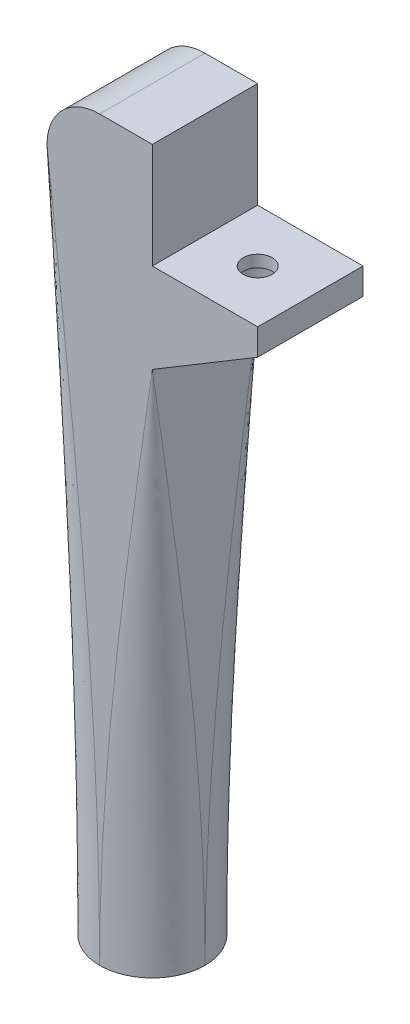
ISO-10303-21;
HEADER;
FILE_DESCRIPTION(('STEP AP214'),'2;1');
FILE_NAME('part.step','',(''),(''),'','','');
FILE_SCHEMA(('AUTOMOTIVE_DESIGN { 1 0 10303 214 1 1 1 1 }'));
ENDSEC;
DATA;
#1=APPLICATION_CONTEXT('core data for automotive mechanical design processes');
#2=APPLICATION_PROTOCOL_DEFINITION('international standard','automotive_design',2000,#1);
#3=PRODUCT_CONTEXT('',#1,'mechanical');
#4=PRODUCT('Part','Part','',(#3));
#5=PRODUCT_RELATED_PRODUCT_CATEGORY('part','',(#4));
#6=PRODUCT_DEFINITION_FORMATION('','',#4);
#7=PRODUCT_DEFINITION_CONTEXT('part definition',#1,'design');
#8=PRODUCT_DEFINITION('design','',#6,#7);
#9=PRODUCT_DEFINITION_SHAPE('','',#8);
#10=(LENGTH_UNIT() NAMED_UNIT(*) SI_UNIT(.MILLI.,.METRE.));
#11=(NAMED_UNIT(*) PLANE_ANGLE_UNIT() SI_UNIT($,.RADIAN.));
#12=(NAMED_UNIT(*) SI_UNIT($,.STERADIAN.) SOLID_ANGLE_UNIT());
#13=UNCERTAINTY_MEASURE_WITH_UNIT(LENGTH_MEASURE(1.E-05),#10,'distance_accuracy_value','');
#14=(GEOMETRIC_REPRESENTATION_CONTEXT(3) GLOBAL_UNCERTAINTY_ASSIGNED_CONTEXT((#13)) GLOBAL_UNIT_ASSIGNED_CONTEXT((#10,
#11,#12)) REPRESENTATION_CONTEXT('',''));
#15=CARTESIAN_POINT('',(0.,0.,0.));
#16=DIRECTION('',(0.,0.,1.));
#17=DIRECTION('',(1.,0.,0.));
#18=AXIS2_PLACEMENT_3D('',#15,#16,#17);
#19=CARTESIAN_POINT('',(0.,0.,20.));
#20=DIRECTION('',(0.,1.,0.));
#21=DIRECTION('',(0.,0.,1.));
#22=AXIS2_PLACEMENT_3D('',#19,#20,#21);
#23=PLANE('',#22);
#24=CARTESIAN_POINT('',(10.,0.,10.));
#25=DIRECTION('',(0.,1.,0.));
#26=DIRECTION('',(0.,0.,1.));
#27=AXIS2_PLACEMENT_3D('',#24,#25,#26);
#28=CIRCLE('',#27,2.75);
#29=CARTESIAN_POINT('',(10.,0.,12.75));
#30=VERTEX_POINT('',#29);
#31=EDGE_CURVE('E11',#30,#30,#28,.T.);
#32=ORIENTED_EDGE('',*,*,#31,.T.);
#33=EDGE_LOOP('',(#32));
#34=FACE_BOUND('',#33,.T.);
#35=CARTESIAN_POINT('',(10.,0.,20.));
#36=CARTESIAN_POINT('',(9.75271987841277,0.,20.000017841492));
#37=CARTESIAN_POINT('',(9.50544294645493,0.,19.9908285391097));
#38=CARTESIAN_POINT('',(9.01227790934417,0.,19.954167037792));
#39=CARTESIAN_POINT('',(8.76638963961477,0.,19.9266970532694));
#40=CARTESIAN_POINT('',(8.27726687450478,0.,19.853597009447));
#41=CARTESIAN_POINT('',(8.03403301047984,0.,19.8079627224572));
#42=CARTESIAN_POINT('',(7.5516013686121,0.,19.698789343571));
#43=CARTESIAN_POINT('',(7.31240396160714,0.,19.6352486159618));
#44=CARTESIAN_POINT('',(6.80705088746999,0.,19.4807218306052));
#45=CARTESIAN_POINT('',(6.54167485102888,0.,19.3871726953676));
#46=CARTESIAN_POINT('',(6.01974303253944,0.,19.1780500638151));
#47=CARTESIAN_POINT('',(5.76318766478499,0.,19.0624755346632));
#48=CARTESIAN_POINT('',(5.26070847028161,0.,18.8101168739883));
#49=CARTESIAN_POINT('',(5.01478524418366,0.,18.6733315461819));
#50=CARTESIAN_POINT('',(4.53534312897896,0.,18.3795328168102));
#51=CARTESIAN_POINT('',(4.3018239405806,0.,18.222519903621));
#52=CARTESIAN_POINT('',(3.84885547144545,0.,17.889388785411));
#53=CARTESIAN_POINT('',(3.62940541326505,0.,17.7132716375181));
#54=CARTESIAN_POINT('',(3.20611958473941,0.,17.3431754175425));
#55=CARTESIAN_POINT('',(3.00228394724205,0.,17.1491961935197));
#56=CARTESIAN_POINT('',(2.61166633010787,0.,16.7447439739679));
#57=CARTESIAN_POINT('',(2.42488537371347,0.,16.5342699901964));
#58=CARTESIAN_POINT('',(2.06972093199635,0.,16.0983372777068));
#59=CARTESIAN_POINT('',(1.90133723472248,0.,15.8728787216711));
#60=CARTESIAN_POINT('',(1.58414331189207,0.,15.4085505860467));
#61=CARTESIAN_POINT('',(1.43533540195067,0.,15.1696794246442));
#62=CARTESIAN_POINT('',(1.15837265860147,0.,14.6802444795628));
#63=CARTESIAN_POINT('',(1.03021808306839,0.,14.4296805499399));
#64=CARTESIAN_POINT('',(0.795502949164731,0.,13.9187075581249));
#65=CARTESIAN_POINT('',(0.688937579654796,0.,13.6583007048037));
#66=CARTESIAN_POINT('',(0.498133449714636,0.,13.1294606016106));
#67=CARTESIAN_POINT('',(0.413891168555817,0.,12.8610286248769));
#68=CARTESIAN_POINT('',(0.284551415680254,0.,12.3786083529401));
#69=CARTESIAN_POINT('',(0.234914031101588,0.,12.1658240311521));
#70=CARTESIAN_POINT('',(0.149675911134503,0.,11.7374679470184));
#71=CARTESIAN_POINT('',(0.114074149273069,0.,11.5218963897041));
#72=CARTESIAN_POINT('',(0.0570893449069655,0.,11.0890886521056));
#73=CARTESIAN_POINT('',(0.0356931222786334,0.,10.8718542045453));
#74=CARTESIAN_POINT('',(0.00714189852537917,0.,10.4364141218775));
#75=CARTESIAN_POINT('',(-1.06540741449135E-05,0.,10.2182083262528));
#76=CARTESIAN_POINT('',(0.,0.,10.));
#77=B_SPLINE_CURVE_WITH_KNOTS('',3,(#35,#36,#37,#38,#39,#40,#41,#42,#43,#44,#45,#46,#47,#48,#49,
#50,#51,#52,#53,#54,#55,#56,#57,#58,#59,#60,#61,#62,#63,#64,#65,#66,#67,#68,#69,#70,#71,#72,#73,
#74,#75,#76),.UNSPECIFIED.,.F.,.F.,(4,2,2,2,2,2,2,2,2,2,2,2,2,2,2,2,2,2,2,2,4),(0.,
0.741664636519439,1.48323944856296,2.22498696106609,2.96680225249434,3.80992652672874,
4.65309034732577,5.49630173944328,6.3394927768311,7.18263718024128,8.02578875634769,
8.86899088645285,9.71218330116971,10.5554753673976,11.3987779620392,12.2418924200681,
13.0848738254359,13.7399212627882,14.3949207853939,15.0493117366551,15.7038151697833),.UNSPECIFIED.);
#78=CARTESIAN_POINT('',(10.,0.,20.));
#79=VERTEX_POINT('',#78);
#80=CARTESIAN_POINT('',(0.,0.,10.));
#81=VERTEX_POINT('',#80);
#82=EDGE_CURVE('E216',#79,#81,#77,.T.);
#83=ORIENTED_EDGE('',*,*,#82,.T.);
#84=CARTESIAN_POINT('',(0.,0.,10.));
#85=CARTESIAN_POINT('',(-1.78414919729804E-05,0.,9.75271987841277));
#86=CARTESIAN_POINT('',(0.00917146089034212,0.,9.50544294645493));
#87=CARTESIAN_POINT('',(0.0458329622079737,0.,9.01227790934417));
#88=CARTESIAN_POINT('',(0.0733029467306176,0.,8.76638963961477));
#89=CARTESIAN_POINT('',(0.146402990552991,0.,8.27726687450478));
#90=CARTESIAN_POINT('',(0.192037277542756,0.,8.03403301047983));
#91=CARTESIAN_POINT('',(0.301210656429029,0.,7.55160136861209));
#92=CARTESIAN_POINT('',(0.364751384038197,0.,7.31240396160713));
#93=CARTESIAN_POINT('',(0.519278169394786,0.,6.80705088746999));
#94=CARTESIAN_POINT('',(0.612827304632361,0.,6.54167485102888));
#95=CARTESIAN_POINT('',(0.821949936184924,0.,6.01974303253944));
#96=CARTESIAN_POINT('',(0.937524465336791,0.,5.76318766478498));
#97=CARTESIAN_POINT('',(1.18988312601173,0.,5.26070847028161));
#98=CARTESIAN_POINT('',(1.32666845381815,0.,5.01478524418366));
#99=CARTESIAN_POINT('',(1.62046718318978,0.,4.53534312897896));
#100=CARTESIAN_POINT('',(1.77748009637903,0.,4.3018239405806));
#101=CARTESIAN_POINT('',(2.11061121458902,0.,3.84885547144545));
#102=CARTESIAN_POINT('',(2.28672836248191,0.,3.62940541326505));
#103=CARTESIAN_POINT('',(2.65682458245751,0.,3.20611958473942));
#104=CARTESIAN_POINT('',(2.85080380648027,0.,3.00228394724205));
#105=CARTESIAN_POINT('',(3.2552560260321,0.,2.61166633010787));
#106=CARTESIAN_POINT('',(3.46573000980356,0.,2.42488537371347));
#107=CARTESIAN_POINT('',(3.90166272229319,0.,2.06972093199636));
#108=CARTESIAN_POINT('',(4.12712127832894,0.,1.90133723472248));
#109=CARTESIAN_POINT('',(4.59144941395329,0.,1.58414331189207));
#110=CARTESIAN_POINT('',(4.8303205753558,0.,1.43533540195067));
#111=CARTESIAN_POINT('',(5.31975552043722,0.,1.15837265860148));
#112=CARTESIAN_POINT('',(5.57031945006007,0.,1.0302180830684));
#113=CARTESIAN_POINT('',(6.08129244187512,0.,0.795502949164733));
#114=CARTESIAN_POINT('',(6.34169929519632,0.,0.688937579654798));
#115=CARTESIAN_POINT('',(6.87053939838941,0.,0.498133449714637));
#116=CARTESIAN_POINT('',(7.13897137512309,0.,0.413891168555818));
#117=CARTESIAN_POINT('',(7.62139164705989,0.,0.284551415680255));
#118=CARTESIAN_POINT('',(7.8341759688479,0.,0.234914031101589));
#119=CARTESIAN_POINT('',(8.26253205298162,0.,0.149675911134504));
#120=CARTESIAN_POINT('',(8.47810361029594,0.,0.11407414927307));
#121=CARTESIAN_POINT('',(8.91091134789444,0.,0.0570893449069657));
#122=CARTESIAN_POINT('',(9.12814579545467,0.,0.0356931222786335));
#123=CARTESIAN_POINT('',(9.56358587812255,0.,0.00714189852537915));
#124=CARTESIAN_POINT('',(9.78179167374726,0.,-1.06540741449037E-05));
#125=CARTESIAN_POINT('',(10.,0.,0.));
#126=B_SPLINE_CURVE_WITH_KNOTS('',3,(#84,#85,#86,#87,#88,#89,#90,#91,#92,#93,#94,#95,#96,#97,
#98,#99,#100,#101,#102,#103,#104,#105,#106,#107,#108,#109,#110,#111,#112,#113,#114,#115,#116,
#117,#118,#119,#120,#121,#122,#123,#124,#125),.UNSPECIFIED.,.F.,.F.,(4,2,2,2,2,2,2,2,2,2,2,2,2,
2,2,2,2,2,2,2,4),(0.,0.741664636519441,1.48323944856296,2.2249869610661,2.96680225249435,
3.80992652672875,4.65309034732578,5.49630173944328,6.33949277683111,7.18263718024129,
8.02578875634768,8.86899088645285,9.71218330116971,10.5554753673976,11.3987779620392,
12.2418924200681,13.0848738254359,13.7399212627882,14.3949207853939,15.0493117366551,
15.7038151697833),.UNSPECIFIED.);
#127=CARTESIAN_POINT('',(9.99999999999999,0.,0.));
#128=VERTEX_POINT('',#127);
#129=EDGE_CURVE('E258',#81,#128,#126,.T.);
#130=ORIENTED_EDGE('',*,*,#129,.T.);
#131=CARTESIAN_POINT('',(9.99999999999999,0.,0.));
#132=CARTESIAN_POINT('',(10.2454570248079,0.,-1.73070754024521E-05));
#133=CARTESIAN_POINT('',(10.4909109087458,0.,0.0090367398370779));
#134=CARTESIAN_POINT('',(10.9804590130464,0.,0.045159927702347));
#135=CARTESIAN_POINT('',(11.2245533990691,0.,0.0722268230478383));
#136=CARTESIAN_POINT('',(11.7101587364008,0.,0.144258203646837));
#137=CARTESIAN_POINT('',(11.9516689476012,0.,0.189227682388885));
#138=CARTESIAN_POINT('',(12.4307421259728,0.,0.296816460765953));
#139=CARTESIAN_POINT('',(12.6683047112686,0.,0.359437457524258));
#140=CARTESIAN_POINT('',(13.1722516230165,0.,0.512333044816977));
#141=CARTESIAN_POINT('',(13.4378236260894,0.,0.605300022705861));
#142=CARTESIAN_POINT('',(13.9602075972998,0.,0.81328092437707));
#143=CARTESIAN_POINT('',(14.2170187483315,0.,0.928296898035205));
#144=CARTESIAN_POINT('',(14.7200497958023,0.,1.17955941158218));
#145=CARTESIAN_POINT('',(14.9662693388811,0.,1.31580665909479));
#146=CARTESIAN_POINT('',(15.4463550388694,0.,1.60856001244902));
#147=CARTESIAN_POINT('',(15.6802211535875,0.,1.76506618747571));
#148=CARTESIAN_POINT('',(16.1339207350364,0.,2.09721242950568));
#149=CARTESIAN_POINT('',(16.3537552162283,0.,2.2728511107735));
#150=CARTESIAN_POINT('',(16.7778488131828,0.,2.64202457370424));
#151=CARTESIAN_POINT('',(16.9821077936115,0.,2.83555951083355));
#152=CARTESIAN_POINT('',(17.3736065050345,0.,3.2391589129875));
#153=CARTESIAN_POINT('',(17.5608453430407,0.,3.44922424422742));
#154=CARTESIAN_POINT('',(17.9169584485869,0.,3.88437967054396));
#155=CARTESIAN_POINT('',(18.0858329240806,0.,4.10946959543909));
#156=CARTESIAN_POINT('',(18.4040373129911,0.,4.5731022706718));
#157=CARTESIAN_POINT('',(18.5533649798149,0.,4.81164656287323));
#158=CARTESIAN_POINT('',(18.831392936054,0.,5.30047235943414));
#159=CARTESIAN_POINT('',(18.9600929889025,0.,5.55075399836023));
#160=CARTESIAN_POINT('',(19.1959225416279,0.,6.06121285578132));
#161=CARTESIAN_POINT('',(19.3030565640279,0.,6.32138798591885));
#162=CARTESIAN_POINT('',(19.4950156525827,0.,6.84981410042397));
#163=CARTESIAN_POINT('',(19.5798441390948,0.,7.11806383958262));
#164=CARTESIAN_POINT('',(19.7107104149243,0.,7.60195545500086));
#165=CARTESIAN_POINT('',(19.761170273782,0.,7.81641390804639));
#166=CARTESIAN_POINT('',(19.847823692893,0.,8.24818832096255));
#167=CARTESIAN_POINT('',(19.8840182742843,0.,8.46550407515049));
#168=CARTESIAN_POINT('',(19.9419544466413,0.,8.90185357736196));
#169=CARTESIAN_POINT('',(19.9637089062576,0.,9.12088561923699));
#170=CARTESIAN_POINT('',(19.9927384205511,0.,9.55994414405435));
#171=CARTESIAN_POINT('',(20.0000110264744,0.,9.77997078887215));
#172=CARTESIAN_POINT('',(20.,0.,10.));
#173=B_SPLINE_CURVE_WITH_KNOTS('',3,(#131,#132,#133,#134,#135,#136,#137,#138,#139,#140,#141,
#142,#143,#144,#145,#146,#147,#148,#149,#150,#151,#152,#153,#154,#155,#156,#157,#158,#159,#160,
#161,#162,#163,#164,#165,#166,#167,#168,#169,#170,#171,#172),.UNSPECIFIED.,.F.,.F.,(4,2,2,2,2,2,
2,2,2,2,2,2,2,2,2,2,2,2,2,2,4),(0.,0.736199150653442,1.47230653877572,2.20861939009667,
2.94500305913229,3.78810210086328,4.63127956281891,5.47448513331312,6.3176935834653,
7.16084100199459,8.00399574570977,8.84719470134638,9.69038410780451,10.5336703404658,
11.3769662436206,12.2200851180189,13.0630746320776,13.7235627974722,14.3840036751724,
15.0438551925732,15.7038182755789),.UNSPECIFIED.);
#174=CARTESIAN_POINT('',(20.,0.,9.99999999999999));
#175=VERTEX_POINT('',#174);
#176=EDGE_CURVE('E252',#128,#175,#173,.T.);
#177=ORIENTED_EDGE('',*,*,#176,.T.);
#178=CARTESIAN_POINT('',(20.,0.,9.99999999999999));
#179=CARTESIAN_POINT('',(20.0000173070754,0.,10.2454570248079));
#180=CARTESIAN_POINT('',(19.9909632601629,0.,10.4909109087458));
#181=CARTESIAN_POINT('',(19.9548400722976,0.,10.9804590130464));
#182=CARTESIAN_POINT('',(19.9277731769522,0.,11.2245533990691));
#183=CARTESIAN_POINT('',(19.8557417963532,0.,11.7101587364008));
#184=CARTESIAN_POINT('',(19.8107723176111,0.,11.9516689476012));
#185=CARTESIAN_POINT('',(19.703183539234,0.,12.4307421259728));
#186=CARTESIAN_POINT('',(19.6405625424757,0.,12.6683047112686));
#187=CARTESIAN_POINT('',(19.487666955183,0.,13.1722516230165));
#188=CARTESIAN_POINT('',(19.3946999772941,0.,13.4378236260894));
#189=CARTESIAN_POINT('',(19.1867190756229,0.,13.9602075972998));
#190=CARTESIAN_POINT('',(19.0717031019648,0.,14.2170187483315));
#191=CARTESIAN_POINT('',(18.8204405884178,0.,14.7200497958023));
#192=CARTESIAN_POINT('',(18.6841933409052,0.,14.9662693388812));
#193=CARTESIAN_POINT('',(18.391439987551,0.,15.4463550388694));
#194=CARTESIAN_POINT('',(18.2349338125243,0.,15.6802211535875));
#195=CARTESIAN_POINT('',(17.9027875704943,0.,16.1339207350364));
#196=CARTESIAN_POINT('',(17.7271488892265,0.,16.3537552162283));
#197=CARTESIAN_POINT('',(17.3579754262957,0.,16.7778488131828));
#198=CARTESIAN_POINT('',(17.1644404891664,0.,16.9821077936115));
#199=CARTESIAN_POINT('',(16.7608410870125,0.,17.3736065050345));
#200=CARTESIAN_POINT('',(16.5507757557726,0.,17.5608453430407));
#201=CARTESIAN_POINT('',(16.115620329456,0.,17.9169584485869));
#202=CARTESIAN_POINT('',(15.8905304045609,0.,18.0858329240806));
#203=CARTESIAN_POINT('',(15.4268977293282,0.,18.4040373129911));
#204=CARTESIAN_POINT('',(15.1883534371268,0.,18.5533649798149));
#205=CARTESIAN_POINT('',(14.6995276405659,0.,18.831392936054));
#206=CARTESIAN_POINT('',(14.4492460016398,0.,18.9600929889025));
#207=CARTESIAN_POINT('',(13.9387871442187,0.,19.1959225416279));
#208=CARTESIAN_POINT('',(13.6786120140811,0.,19.3030565640279));
#209=CARTESIAN_POINT('',(13.150185899576,0.,19.4950156525827));
#210=CARTESIAN_POINT('',(12.8819361604174,0.,19.5798441390948));
#211=CARTESIAN_POINT('',(12.3980445449991,0.,19.7107104149243));
#212=CARTESIAN_POINT('',(12.1835860919536,0.,19.761170273782));
#213=CARTESIAN_POINT('',(11.7518116790374,0.,19.847823692893));
#214=CARTESIAN_POINT('',(11.5344959248495,0.,19.8840182742843));
#215=CARTESIAN_POINT('',(11.098146422638,0.,19.9419544466413));
#216=CARTESIAN_POINT('',(10.879114380763,0.,19.9637089062576));
#217=CARTESIAN_POINT('',(10.4400558559456,0.,19.9927384205511));
#218=CARTESIAN_POINT('',(10.2200292111278,0.,20.0000110264743));
#219=CARTESIAN_POINT('',(9.99999999999999,0.,20.));
#220=B_SPLINE_CURVE_WITH_KNOTS('',3,(#178,#179,#180,#181,#182,#183,#184,#185,#186,#187,#188,
#189,#190,#191,#192,#193,#194,#195,#196,#197,#198,#199,#200,#201,#202,#203,#204,#205,#206,#207,
#208,#209,#210,#211,#212,#213,#214,#215,#216,#217,#218,#219),.UNSPECIFIED.,.F.,.F.,(4,2,2,2,2,2,
2,2,2,2,2,2,2,2,2,2,2,2,2,2,4),(0.,0.736199150653441,1.47230653877572,2.20861939009667,
2.94500305913229,3.78810210086329,4.63127956281891,5.47448513331313,6.31769358346531,
7.1608410019946,8.00399574570978,8.84719470134639,9.69038410780452,10.5336703404659,
11.3769662436206,12.2200851180189,13.0630746320776,13.7235627974722,14.3840036751724,
15.0438551925732,15.7038182755789),.UNSPECIFIED.);
#221=EDGE_CURVE('E226',#175,#79,#220,.T.);
#222=ORIENTED_EDGE('',*,*,#221,.T.);
#223=EDGE_LOOP('',(#83,#130,#177,#222));
#224=FACE_BOUND('',#223,.T.);
#225=ADVANCED_FACE('F43',(#34,#224),#23,.F.);
#226=CARTESIAN_POINT('',(-40.1470588235294,66.9117647058824,20.));
#227=DIRECTION('',(0.514495755427526,-0.857492925712544,0.));
#228=DIRECTION('',(0.857492925712544,0.514495755427526,0.));
#229=AXIS2_PLACEMENT_3D('',#226,#227,#228);
#230=PLANE('',#229);
#231=CARTESIAN_POINT('',(30.,109.,10.));
#232=DIRECTION('',(0.514495755427526,-0.857492925712544,0.));
#233=DIRECTION('',(-0.857492925712544,-0.514495755427526,0.));
#234=AXIS2_PLACEMENT_3D('',#231,#232,#233);
#235=ELLIPSE('',#234,6.12249948958756,5.25);
#236=CARTESIAN_POINT('',(24.75,105.85,10.));
#237=VERTEX_POINT('',#236);
#238=EDGE_CURVE('E136',#237,#237,#235,.T.);
#239=ORIENTED_EDGE('',*,*,#238,.F.);
#240=EDGE_LOOP('',(#239));
#241=FACE_BOUND('',#240,.T.);
#242=DIRECTION('',(-0.857492925712544,-0.514495755427526,0.));
#243=VECTOR('',#242,1.);
#244=CARTESIAN_POINT('',(-40.1470588235294,66.9117647058824,0.));
#245=LINE('',#244,#243);
#246=CARTESIAN_POINT('',(40.,115.,0.));
#247=VERTEX_POINT('',#246);
#248=CARTESIAN_POINT('',(20.,103.,0.));
#249=VERTEX_POINT('',#248);
#250=EDGE_CURVE('E153',#247,#249,#245,.T.);
#251=ORIENTED_EDGE('',*,*,#250,.F.);
#252=DIRECTION('',(0.,0.,-1.));
#253=VECTOR('',#252,1.);
#254=CARTESIAN_POINT('',(40.,115.,20.));
#255=LINE('',#254,#253);
#256=CARTESIAN_POINT('',(40.,115.,20.));
#257=VERTEX_POINT('',#256);
#258=EDGE_CURVE('E176',#257,#247,#255,.T.);
#259=ORIENTED_EDGE('',*,*,#258,.F.);
#260=DIRECTION('',(-0.857492925712544,-0.514495755427526,0.));
#261=VECTOR('',#260,1.);
#262=CARTESIAN_POINT('',(-40.1470588235294,66.9117647058824,20.));
#263=LINE('',#262,#261);
#264=CARTESIAN_POINT('',(20.,103.,20.));
#265=VERTEX_POINT('',#264);
#266=EDGE_CURVE('E137',#257,#265,#263,.T.);
#267=ORIENTED_EDGE('',*,*,#266,.T.);
#268=DIRECTION('',(0.,0.,-1.));
#269=VECTOR('',#268,1.);
#270=CARTESIAN_POINT('',(20.,103.,20.));
#271=LINE('',#270,#269);
#272=EDGE_CURVE('E152',#265,#249,#271,.T.);
#273=ORIENTED_EDGE('',*,*,#272,.T.);
#274=EDGE_LOOP('',(#251,#259,#267,#273));
#275=FACE_BOUND('',#274,.T.);
#276=ADVANCED_FACE('F242',(#241,#275),#230,.T.);
#277=CARTESIAN_POINT('',(40.,0.,20.));
#278=DIRECTION('',(1.,0.,0.));
#279=DIRECTION('',(0.,0.,-1.));
#280=AXIS2_PLACEMENT_3D('',#277,#278,#279);
#281=PLANE('',#280);
#282=DIRECTION('',(0.,-1.,0.));
#283=VECTOR('',#282,1.);
#284=CARTESIAN_POINT('',(40.,0.,0.));
#285=LINE('',#284,#283);
#286=CARTESIAN_POINT('',(40.,120.,0.));
#287=VERTEX_POINT('',#286);
#288=EDGE_CURVE('E156',#287,#247,#285,.T.);
#289=ORIENTED_EDGE('',*,*,#288,.F.);
#290=DIRECTION('',(0.,0.,-1.));
#291=VECTOR('',#290,1.);
#292=CARTESIAN_POINT('',(40.,120.,20.));
#293=LINE('',#292,#291);
#294=CARTESIAN_POINT('',(40.,120.,20.));
#295=VERTEX_POINT('',#294);
#296=EDGE_CURVE('E174',#295,#287,#293,.T.);
#297=ORIENTED_EDGE('',*,*,#296,.F.);
#298=DIRECTION('',(0.,-1.,0.));
#299=VECTOR('',#298,1.);
#300=CARTESIAN_POINT('',(40.,0.,20.));
#301=LINE('',#300,#299);
#302=EDGE_CURVE('E140',#295,#257,#301,.T.);
#303=ORIENTED_EDGE('',*,*,#302,.T.);
#304=ORIENTED_EDGE('',*,*,#258,.T.);
#305=EDGE_LOOP('',(#289,#297,#303,#304));
#306=FACE_BOUND('',#305,.T.);
#307=ADVANCED_FACE('F396',(#306),#281,.T.);
#308=CARTESIAN_POINT('',(0.,120.,20.));
#309=DIRECTION('',(0.,1.,0.));
#310=DIRECTION('',(0.,0.,1.));
#311=AXIS2_PLACEMENT_3D('',#308,#309,#310);
#312=PLANE('',#311);
#313=CARTESIAN_POINT('',(30.,120.,10.));
#314=DIRECTION('',(0.,1.,0.));
#315=DIRECTION('',(0.,0.,1.));
#316=AXIS2_PLACEMENT_3D('',#313,#314,#315);
#317=CIRCLE('',#316,2.75);
#318=CARTESIAN_POINT('',(30.,120.,12.75));
#319=VERTEX_POINT('',#318);
#320=EDGE_CURVE('E157',#319,#319,#317,.T.);
#321=ORIENTED_EDGE('',*,*,#320,.F.);
#322=EDGE_LOOP('',(#321));
#323=FACE_BOUND('',#322,.T.);
#324=DIRECTION('',(1.,0.,0.));
#325=VECTOR('',#324,1.);
#326=CARTESIAN_POINT('',(0.,120.,0.));
#327=LINE('',#326,#325);
#328=CARTESIAN_POINT('',(20.,120.,0.));
#329=VERTEX_POINT('',#328);
#330=EDGE_CURVE('E160',#329,#287,#327,.T.);
#331=ORIENTED_EDGE('',*,*,#330,.F.);
#332=DIRECTION('',(0.,0.,-1.));
#333=VECTOR('',#332,1.);
#334=CARTESIAN_POINT('',(20.,120.,20.));
#335=LINE('',#334,#333);
#336=CARTESIAN_POINT('',(20.,120.,20.));
#337=VERTEX_POINT('',#336);
#338=EDGE_CURVE('E172',#337,#329,#335,.T.);
#339=ORIENTED_EDGE('',*,*,#338,.F.);
#340=DIRECTION('',(1.,0.,0.));
#341=VECTOR('',#340,1.);
#342=CARTESIAN_POINT('',(0.,120.,20.));
#343=LINE('',#342,#341);
#344=EDGE_CURVE('E144',#337,#295,#343,.T.);
#345=ORIENTED_EDGE('',*,*,#344,.T.);
#346=ORIENTED_EDGE('',*,*,#296,.T.);
#347=EDGE_LOOP('',(#331,#339,#345,#346));
#348=FACE_BOUND('',#347,.T.);
#349=ADVANCED_FACE('F391',(#323,#348),#312,.T.);
#350=CARTESIAN_POINT('',(20.,0.,20.));
#351=DIRECTION('',(-1.,0.,0.));
#352=DIRECTION('',(0.,0.,1.));
#353=AXIS2_PLACEMENT_3D('',#350,#351,#352);
#354=PLANE('',#353);
#355=DIRECTION('',(0.,1.,0.));
#356=VECTOR('',#355,1.);
#357=CARTESIAN_POINT('',(20.,0.,0.));
#358=LINE('',#357,#356);
#359=CARTESIAN_POINT('',(20.,140.,0.));
#360=VERTEX_POINT('',#359);
#361=EDGE_CURVE('E163',#329,#360,#358,.T.);
#362=ORIENTED_EDGE('',*,*,#361,.T.);
#363=DIRECTION('',(0.,0.,-1.));
#364=VECTOR('',#363,1.);
#365=CARTESIAN_POINT('',(20.,140.,20.));
#366=LINE('',#365,#364);
#367=CARTESIAN_POINT('',(20.,140.,20.));
#368=VERTEX_POINT('',#367);
#369=EDGE_CURVE('E169',#368,#360,#366,.T.);
#370=ORIENTED_EDGE('',*,*,#369,.F.);
#371=DIRECTION('',(0.,1.,0.));
#372=VECTOR('',#371,1.);
#373=CARTESIAN_POINT('',(20.,0.,20.));
#374=LINE('',#373,#372);
#375=EDGE_CURVE('E147',#337,#368,#374,.T.);
#376=ORIENTED_EDGE('',*,*,#375,.F.);
#377=ORIENTED_EDGE('',*,*,#338,.T.);
#378=EDGE_LOOP('',(#362,#370,#376,#377));
#379=FACE_BOUND('',#378,.T.);
#380=ADVANCED_FACE('F388',(#379),#354,.F.);
#381=CARTESIAN_POINT('',(0.,140.,20.));
#382=DIRECTION('',(0.,1.,0.));
#383=DIRECTION('',(0.,0.,1.));
#384=AXIS2_PLACEMENT_3D('',#381,#382,#383);
#385=PLANE('',#384);
#386=DIRECTION('',(1.,0.,0.));
#387=VECTOR('',#386,1.);
#388=CARTESIAN_POINT('',(0.,140.,0.));
#389=LINE('',#388,#387);
#390=CARTESIAN_POINT('',(10.,140.,0.));
#391=VERTEX_POINT('',#390);
#392=EDGE_CURVE('E141',#391,#360,#389,.T.);
#393=ORIENTED_EDGE('',*,*,#392,.F.);
#394=DIRECTION('',(0.,0.,-1.));
#395=VECTOR('',#394,1.);
#396=CARTESIAN_POINT('',(10.,140.,20.));
#397=LINE('',#396,#395);
#398=CARTESIAN_POINT('',(10.,140.,20.));
#399=VERTEX_POINT('',#398);
#400=EDGE_CURVE('E183',#391,#399,#397,.F.);
#401=ORIENTED_EDGE('',*,*,#400,.T.);
#402=DIRECTION('',(1.,0.,0.));
#403=VECTOR('',#402,1.);
#404=CARTESIAN_POINT('',(0.,140.,20.));
#405=LINE('',#404,#403);
#406=EDGE_CURVE('E150',#399,#368,#405,.T.);
#407=ORIENTED_EDGE('',*,*,#406,.T.);
#408=ORIENTED_EDGE('',*,*,#369,.T.);
#409=EDGE_LOOP('',(#393,#401,#407,#408));
#410=FACE_BOUND('',#409,.T.);
#411=ADVANCED_FACE('F383',(#410),#385,.T.);
#412=CARTESIAN_POINT('',(0.,0.,20.));
#413=DIRECTION('',(-1.,0.,0.));
#414=DIRECTION('',(0.,0.,1.));
#415=AXIS2_PLACEMENT_3D('',#412,#413,#414);
#416=PLANE('',#415);
#417=DIRECTION('',(0.,0.,-1.));
#418=VECTOR('',#417,1.);
#419=CARTESIAN_POINT('',(0.,130.,20.));
#420=LINE('',#419,#418);
#421=CARTESIAN_POINT('',(0.,130.,20.));
#422=VERTEX_POINT('',#421);
#423=CARTESIAN_POINT('',(0.,130.,0.));
#424=VERTEX_POINT('',#423);
#425=EDGE_CURVE('E178',#422,#424,#420,.T.);
#426=ORIENTED_EDGE('',*,*,#425,.T.);
#427=CARTESIAN_POINT('',(0.,-259.999999999998,10.));
#428=CARTESIAN_POINT('',(0.,-177.666666666666,10.));
#429=CARTESIAN_POINT('',(0.,-95.3333333333328,10.));
#430=CARTESIAN_POINT('',(0.,-13.,10.));
#431=CARTESIAN_POINT('',(0.,-8.66666666666667,10.));
#432=CARTESIAN_POINT('',(0.,-4.33333333333334,10.));
#433=CARTESIAN_POINT('',(0.,0.,10.));
#434=CARTESIAN_POINT('',(0.,43.3333333333331,10.));
#435=CARTESIAN_POINT('',(0.,86.6666666666667,5.));
#436=CARTESIAN_POINT('',(0.,130.,0.));
#437=(BOUNDED_CURVE() B_SPLINE_CURVE(3,(#427,#428,#429,#430,#431,#432,#433,#434,#435,#436),
.UNSPECIFIED.,.F.,.F.) B_SPLINE_CURVE_WITH_KNOTS((4,3,3,4),(-1.72727272727273,0.,
0.0909090909090914,1.),
.UNSPECIFIED.) CURVE() GEOMETRIC_REPRESENTATION_ITEM() RATIONAL_B_SPLINE_CURVE((1.,1.,1.,1.,1.,
1.,1.,1.,1.,1.)) REPRESENTATION_ITEM(''));
#438=EDGE_CURVE('E208',#424,#81,#437,.F.);
#439=ORIENTED_EDGE('',*,*,#438,.T.);
#440=CARTESIAN_POINT('',(0.,-259.999999999998,9.9999999999999));
#441=CARTESIAN_POINT('',(0.,-177.666666666666,9.99999999999994));
#442=CARTESIAN_POINT('',(0.,-95.3333333333328,9.99999999999997));
#443=CARTESIAN_POINT('',(0.,-13.,10.));
#444=CARTESIAN_POINT('',(0.,-8.66666666666667,10.));
#445=CARTESIAN_POINT('',(0.,-4.33333333333334,10.));
#446=CARTESIAN_POINT('',(0.,0.,10.));
#447=CARTESIAN_POINT('',(0.,43.3333333333332,10.));
#448=CARTESIAN_POINT('',(0.,86.6666666666667,15.));
#449=CARTESIAN_POINT('',(0.,130.,20.));
#450=(BOUNDED_CURVE() B_SPLINE_CURVE(3,(#440,#441,#442,#443,#444,#445,#446,#447,#448,#449),
.UNSPECIFIED.,.F.,.F.) B_SPLINE_CURVE_WITH_KNOTS((4,3,3,4),(-1.72727272727273,0.,
0.0909090909090914,1.),
.UNSPECIFIED.) CURVE() GEOMETRIC_REPRESENTATION_ITEM() RATIONAL_B_SPLINE_CURVE((1.,1.,1.,1.,1.,
1.,1.,1.,1.,1.)) REPRESENTATION_ITEM(''));
#451=EDGE_CURVE('E200',#81,#422,#450,.T.);
#452=ORIENTED_EDGE('',*,*,#451,.T.);
#453=EDGE_LOOP('',(#426,#439,#452));
#454=FACE_BOUND('',#453,.T.);
#455=ADVANCED_FACE('F246',(#454),#416,.T.);
#456=CARTESIAN_POINT('',(20.0000000000002,-206.,10.0000000000002));
#457=CARTESIAN_POINT('',(20.0000000000001,-140.766666666667,10.0000000000001));
#458=CARTESIAN_POINT('',(20.0000000000001,-75.5333333333334,10.0000000000001));
#459=CARTESIAN_POINT('',(20.,-10.3,10.));
#460=CARTESIAN_POINT('',(20.,-6.86666666666667,10.));
#461=CARTESIAN_POINT('',(20.,-3.43333333333333,10.));
#462=CARTESIAN_POINT('',(20.,0.,9.99999999999999));
#463=CARTESIAN_POINT('',(20.,34.3333333333333,9.99999999999998));
#464=CARTESIAN_POINT('',(20.,68.6666666666667,15.));
#465=CARTESIAN_POINT('',(20.,103.,20.));
#466=(BOUNDED_CURVE() B_SPLINE_CURVE(3,(#456,#457,#458,#459,#460,#461,#462,#463,#464,#465),
.UNSPECIFIED.,.F.,.F.) B_SPLINE_CURVE_WITH_KNOTS((4,3,3,4),(-1.72727272727273,0.,
0.090909090909091,1.),
.UNSPECIFIED.) CURVE() GEOMETRIC_REPRESENTATION_ITEM() RATIONAL_B_SPLINE_CURVE((1.,1.,1.,1.,1.,
1.,1.,1.,1.,1.)) REPRESENTATION_ITEM(''));
#467=EDGE_CURVE('E67',#265,#175,#466,.F.);
#468=ORIENTED_EDGE('',*,*,#467,.T.);
#469=CARTESIAN_POINT('',(20.0000000000002,-206.,10.));
#470=CARTESIAN_POINT('',(20.0000000000001,-140.766666666667,10.));
#471=CARTESIAN_POINT('',(20.0000000000001,-75.5333333333333,10.));
#472=CARTESIAN_POINT('',(20.,-10.3,10.));
#473=CARTESIAN_POINT('',(20.,-6.86666666666666,10.));
#474=CARTESIAN_POINT('',(20.,-3.43333333333333,10.));
#475=CARTESIAN_POINT('',(20.,0.,10.));
#476=CARTESIAN_POINT('',(20.,34.3333333333333,10.));
#477=CARTESIAN_POINT('',(20.,68.6666666666667,5.));
#478=CARTESIAN_POINT('',(20.,103.,0.));
#479=(BOUNDED_CURVE() B_SPLINE_CURVE(3,(#469,#470,#471,#472,#473,#474,#475,#476,#477,#478),
.UNSPECIFIED.,.F.,.F.) B_SPLINE_CURVE_WITH_KNOTS((4,3,3,4),(-1.72727272727273,0.,
0.0909090909090909,1.),
.UNSPECIFIED.) CURVE() GEOMETRIC_REPRESENTATION_ITEM() RATIONAL_B_SPLINE_CURVE((1.,1.,1.,1.,1.,
1.,1.,1.,1.,1.)) REPRESENTATION_ITEM(''));
#480=EDGE_CURVE('E312',#175,#249,#479,.T.);
#481=ORIENTED_EDGE('',*,*,#480,.T.);
#482=ORIENTED_EDGE('',*,*,#272,.F.);
#483=EDGE_LOOP('',(#468,#481,#482));
#484=FACE_BOUND('',#483,.T.);
#485=ADVANCED_FACE('F244',(#484),#354,.F.);
#486=CARTESIAN_POINT('',(0.,0.,20.));
#487=DIRECTION('',(0.,0.,1.));
#488=DIRECTION('',(1.,0.,0.));
#489=AXIS2_PLACEMENT_3D('',#486,#487,#488);
#490=PLANE('',#489);
#491=CARTESIAN_POINT('',(10.,-259.999999999998,19.9999999999999));
#492=CARTESIAN_POINT('',(10.,-177.666666666666,19.9999999999999));
#493=CARTESIAN_POINT('',(10.,-95.3333333333328,20.));
#494=CARTESIAN_POINT('',(10.,-13.,20.));
#495=CARTESIAN_POINT('',(10.,-8.66666666666667,20.));
#496=CARTESIAN_POINT('',(10.,-4.33333333333334,20.));
#497=CARTESIAN_POINT('',(10.,0.,20.));
#498=CARTESIAN_POINT('',(10.,43.3333333333331,20.));
#499=CARTESIAN_POINT('',(5.,86.6666666666667,20.));
#500=CARTESIAN_POINT('',(0.,130.,20.));
#501=(BOUNDED_CURVE() B_SPLINE_CURVE(3,(#491,#492,#493,#494,#495,#496,#497,#498,#499,#500),
.UNSPECIFIED.,.F.,.F.) B_SPLINE_CURVE_WITH_KNOTS((4,3,3,4),(-1.72727272727273,0.,
0.0909090909090914,1.),
.UNSPECIFIED.) CURVE() GEOMETRIC_REPRESENTATION_ITEM() RATIONAL_B_SPLINE_CURVE((1.,1.,1.,1.,1.,
1.,1.,1.,1.,1.)) REPRESENTATION_ITEM(''));
#502=EDGE_CURVE('E59',#422,#79,#501,.F.);
#503=ORIENTED_EDGE('',*,*,#502,.T.);
#504=CARTESIAN_POINT('',(10.0000000000002,-206.,20.0000000000002));
#505=CARTESIAN_POINT('',(10.0000000000001,-140.766666666667,20.0000000000001));
#506=CARTESIAN_POINT('',(10.0000000000001,-75.5333333333334,20.0000000000001));
#507=CARTESIAN_POINT('',(10.,-10.3,20.));
#508=CARTESIAN_POINT('',(10.,-6.86666666666667,20.));
#509=CARTESIAN_POINT('',(10.,-3.43333333333333,20.));
#510=CARTESIAN_POINT('',(9.99999999999999,0.,20.));
#511=CARTESIAN_POINT('',(9.99999999999998,34.3333333333333,20.));
#512=CARTESIAN_POINT('',(15.,68.6666666666667,20.));
#513=CARTESIAN_POINT('',(20.,103.,20.));
#514=(BOUNDED_CURVE() B_SPLINE_CURVE(3,(#504,#505,#506,#507,#508,#509,#510,#511,#512,#513),
.UNSPECIFIED.,.F.,.F.) B_SPLINE_CURVE_WITH_KNOTS((4,3,3,4),(-1.72727272727273,0.,
0.090909090909091,1.),
.UNSPECIFIED.) CURVE() GEOMETRIC_REPRESENTATION_ITEM() RATIONAL_B_SPLINE_CURVE((1.,1.,1.,1.,1.,
1.,1.,1.,1.,1.)) REPRESENTATION_ITEM(''));
#515=EDGE_CURVE('E306',#79,#265,#514,.T.);
#516=ORIENTED_EDGE('',*,*,#515,.T.);
#517=ORIENTED_EDGE('',*,*,#266,.F.);
#518=ORIENTED_EDGE('',*,*,#302,.F.);
#519=ORIENTED_EDGE('',*,*,#344,.F.);
#520=ORIENTED_EDGE('',*,*,#375,.T.);
#521=ORIENTED_EDGE('',*,*,#406,.F.);
#522=CARTESIAN_POINT('',(10.,130.,20.));
#523=DIRECTION('',(0.,0.,1.));
#524=DIRECTION('',(1.,0.,0.));
#525=AXIS2_PLACEMENT_3D('',#522,#523,#524);
#526=CIRCLE('',#525,10.);
#527=EDGE_CURVE('E185',#399,#422,#526,.T.);
#528=ORIENTED_EDGE('',*,*,#527,.T.);
#529=EDGE_LOOP('',(#503,#516,#517,#518,#519,#520,#521,#528));
#530=FACE_BOUND('',#529,.T.);
#531=ADVANCED_FACE('F361',(#530),#490,.T.);
#532=CARTESIAN_POINT('',(0.,0.,0.));
#533=DIRECTION('',(0.,0.,1.));
#534=DIRECTION('',(1.,0.,0.));
#535=AXIS2_PLACEMENT_3D('',#532,#533,#534);
#536=PLANE('',#535);
#537=CARTESIAN_POINT('',(10.0000000000002,-206.,0.));
#538=CARTESIAN_POINT('',(10.0000000000001,-140.766666666667,0.));
#539=CARTESIAN_POINT('',(10.0000000000001,-75.5333333333334,0.));
#540=CARTESIAN_POINT('',(10.,-10.3,0.));
#541=CARTESIAN_POINT('',(10.,-6.86666666666667,0.));
#542=CARTESIAN_POINT('',(10.,-3.43333333333334,0.));
#543=CARTESIAN_POINT('',(9.99999999999999,0.,0.));
#544=CARTESIAN_POINT('',(9.99999999999998,34.3333333333333,0.));
#545=CARTESIAN_POINT('',(15.,68.6666666666667,0.));
#546=CARTESIAN_POINT('',(20.,103.,0.));
#547=(BOUNDED_CURVE() B_SPLINE_CURVE(3,(#537,#538,#539,#540,#541,#542,#543,#544,#545,#546),
.UNSPECIFIED.,.F.,.F.) B_SPLINE_CURVE_WITH_KNOTS((4,3,3,4),(-1.72727272727273,0.,
0.0909090909090909,1.),
.UNSPECIFIED.) CURVE() GEOMETRIC_REPRESENTATION_ITEM() RATIONAL_B_SPLINE_CURVE((1.,1.,1.,1.,1.,
1.,1.,1.,1.,1.)) REPRESENTATION_ITEM(''));
#548=EDGE_CURVE('E187',#249,#128,#547,.F.);
#549=ORIENTED_EDGE('',*,*,#548,.T.);
#550=CARTESIAN_POINT('',(10.,-259.999999999998,0.));
#551=CARTESIAN_POINT('',(10.,-177.666666666666,0.));
#552=CARTESIAN_POINT('',(10.,-95.3333333333328,0.));
#553=CARTESIAN_POINT('',(10.,-13.,0.));
#554=CARTESIAN_POINT('',(10.,-8.66666666666667,0.));
#555=CARTESIAN_POINT('',(10.,-4.33333333333334,0.));
#556=CARTESIAN_POINT('',(10.,0.,0.));
#557=CARTESIAN_POINT('',(10.,43.3333333333331,0.));
#558=CARTESIAN_POINT('',(5.,86.6666666666667,0.));
#559=CARTESIAN_POINT('',(0.,130.,0.));
#560=(BOUNDED_CURVE() B_SPLINE_CURVE(3,(#550,#551,#552,#553,#554,#555,#556,#557,#558,#559),
.UNSPECIFIED.,.F.,.F.) B_SPLINE_CURVE_WITH_KNOTS((4,3,3,4),(-1.72727272727273,0.,
0.0909090909090914,1.),
.UNSPECIFIED.) CURVE() GEOMETRIC_REPRESENTATION_ITEM() RATIONAL_B_SPLINE_CURVE((1.,1.,1.,1.,1.,
1.,1.,1.,1.,1.)) REPRESENTATION_ITEM(''));
#561=EDGE_CURVE('E192',#128,#424,#560,.T.);
#562=ORIENTED_EDGE('',*,*,#561,.T.);
#563=CARTESIAN_POINT('',(10.,130.,0.));
#564=DIRECTION('',(0.,0.,1.));
#565=DIRECTION('',(1.,0.,0.));
#566=AXIS2_PLACEMENT_3D('',#563,#564,#565);
#567=CIRCLE('',#566,10.);
#568=EDGE_CURVE('E181',#424,#391,#567,.F.);
#569=ORIENTED_EDGE('',*,*,#568,.T.);
#570=ORIENTED_EDGE('',*,*,#392,.T.);
#571=ORIENTED_EDGE('',*,*,#361,.F.);
#572=ORIENTED_EDGE('',*,*,#330,.T.);
#573=ORIENTED_EDGE('',*,*,#288,.T.);
#574=ORIENTED_EDGE('',*,*,#250,.T.);
#575=EDGE_LOOP('',(#549,#562,#569,#570,#571,#572,#573,#574));
#576=FACE_BOUND('',#575,.T.);
#577=ADVANCED_FACE('F363',(#576),#536,.F.);
#578=CARTESIAN_POINT('',(10.,130.,20.));
#579=DIRECTION('',(0.,0.,-1.));
#580=DIRECTION('',(-1.,0.,0.));
#581=AXIS2_PLACEMENT_3D('',#578,#579,#580);
#582=CYLINDRICAL_SURFACE('',#581,10.);
#583=ORIENTED_EDGE('',*,*,#527,.F.);
#584=ORIENTED_EDGE('',*,*,#400,.F.);
#585=ORIENTED_EDGE('',*,*,#568,.F.);
#586=ORIENTED_EDGE('',*,*,#425,.F.);
#587=EDGE_LOOP('',(#583,#584,#585,#586));
#588=FACE_BOUND('',#587,.T.);
#589=ADVANCED_FACE('F365',(#588),#582,.T.);
#590=CARTESIAN_POINT('',(10.,-25.9999999999998,0.));
#591=CARTESIAN_POINT('',(10.,-21.6666666666666,0.));
#592=CARTESIAN_POINT('',(10.,-17.3333333333333,0.));
#593=CARTESIAN_POINT('',(10.,-13.,0.));
#594=CARTESIAN_POINT('',(10.,-8.66666666666667,0.));
#595=CARTESIAN_POINT('',(10.,-4.33333333333334,0.));
#596=CARTESIAN_POINT('',(10.,0.,0.));
#597=CARTESIAN_POINT('',(10.,43.3333333333331,0.));
#598=CARTESIAN_POINT('',(5.,86.6666666666667,0.));
#599=CARTESIAN_POINT('',(0.,130.,0.));
#600=CARTESIAN_POINT('',(0.,-25.9999999999998,0.));
#601=CARTESIAN_POINT('',(0.,-21.6666666666665,0.));
#602=CARTESIAN_POINT('',(0.,-17.3333333333333,0.));
#603=CARTESIAN_POINT('',(0.,-13.,0.));
#604=CARTESIAN_POINT('',(0.,-8.66666666666667,0.));
#605=CARTESIAN_POINT('',(0.,-4.33333333333334,0.));
#606=CARTESIAN_POINT('',(0.,0.,0.));
#607=CARTESIAN_POINT('',(0.,43.3333333333331,0.));
#608=CARTESIAN_POINT('',(0.,86.6666666666667,0.));
#609=CARTESIAN_POINT('',(0.,130.,0.));
#610=CARTESIAN_POINT('',(0.,-25.9999999999998,10.));
#611=CARTESIAN_POINT('',(0.,-21.6666666666666,10.));
#612=CARTESIAN_POINT('',(0.,-17.3333333333333,10.));
#613=CARTESIAN_POINT('',(0.,-13.,10.));
#614=CARTESIAN_POINT('',(0.,-8.66666666666667,10.));
#615=CARTESIAN_POINT('',(0.,-4.33333333333334,10.));
#616=CARTESIAN_POINT('',(0.,0.,10.));
#617=CARTESIAN_POINT('',(0.,43.3333333333331,10.));
#618=CARTESIAN_POINT('',(0.,86.6666666666667,5.));
#619=CARTESIAN_POINT('',(0.,130.,0.));
#620=(BOUNDED_SURFACE() B_SPLINE_SURFACE(2,3,((#590,#591,#592,#593,#594,#595,#596,#597,#598,
#599),(#600,#601,#602,#603,#604,#605,#606,#607,#608,#609),(#610,#611,#612,#613,#614,#615,#616,
#617,#618,#619)),.UNSPECIFIED.,.F.,.F.,.F.) B_SPLINE_SURFACE_WITH_KNOTS((3,3),(4,3,3,4),(0.,1.),
(-0.0909090909090902,0.,0.0909090909090914,1.),
.UNSPECIFIED.) GEOMETRIC_REPRESENTATION_ITEM() RATIONAL_B_SPLINE_SURFACE(((1.,1.,1.,1.,1.,1.,1.,
1.,1.,1.),(0.707106781186548,0.707106781186548,0.707106781186548,0.707106781186548,
0.707106781186548,0.707106781186548,0.707106781186548,0.707106781186548,0.707106781186548,
0.707106781186548),(1.,1.,1.,1.,1.,1.,1.,1.,1.,1.))) REPRESENTATION_ITEM('') SURFACE());
#621=ORIENTED_EDGE('',*,*,#129,.F.);
#622=ORIENTED_EDGE('',*,*,#438,.F.);
#623=ORIENTED_EDGE('',*,*,#561,.F.);
#624=EDGE_LOOP('',(#621,#622,#623));
#625=FACE_BOUND('',#624,.T.);
#626=ADVANCED_FACE('F276',(#625),#620,.T.);
#627=CARTESIAN_POINT('',(20.,-20.6,10.));
#628=CARTESIAN_POINT('',(20.,-17.1666666666667,10.));
#629=CARTESIAN_POINT('',(20.,-13.7333333333333,10.));
#630=CARTESIAN_POINT('',(20.,-10.3,10.));
#631=CARTESIAN_POINT('',(20.,-6.86666666666666,10.));
#632=CARTESIAN_POINT('',(20.,-3.43333333333333,10.));
#633=CARTESIAN_POINT('',(20.,0.,10.));
#634=CARTESIAN_POINT('',(20.,34.3333333333333,10.));
#635=CARTESIAN_POINT('',(20.,68.6666666666667,5.));
#636=CARTESIAN_POINT('',(20.,103.,0.));
#637=CARTESIAN_POINT('',(20.,-20.6,0.));
#638=CARTESIAN_POINT('',(20.,-17.1666666666667,0.));
#639=CARTESIAN_POINT('',(20.,-13.7333333333333,0.));
#640=CARTESIAN_POINT('',(20.,-10.3,0.));
#641=CARTESIAN_POINT('',(20.,-6.86666666666666,0.));
#642=CARTESIAN_POINT('',(20.,-3.43333333333333,0.));
#643=CARTESIAN_POINT('',(20.,0.,0.));
#644=CARTESIAN_POINT('',(20.,34.3333333333333,0.));
#645=CARTESIAN_POINT('',(20.,68.6666666666667,0.));
#646=CARTESIAN_POINT('',(20.,103.,0.));
#647=CARTESIAN_POINT('',(10.,-20.6,0.));
#648=CARTESIAN_POINT('',(10.,-17.1666666666667,0.));
#649=CARTESIAN_POINT('',(10.,-13.7333333333333,0.));
#650=CARTESIAN_POINT('',(10.,-10.3,0.));
#651=CARTESIAN_POINT('',(10.,-6.86666666666667,0.));
#652=CARTESIAN_POINT('',(10.,-3.43333333333334,0.));
#653=CARTESIAN_POINT('',(9.99999999999999,0.,0.));
#654=CARTESIAN_POINT('',(9.99999999999998,34.3333333333333,0.));
#655=CARTESIAN_POINT('',(15.,68.6666666666667,0.));
#656=CARTESIAN_POINT('',(20.,103.,0.));
#657=(BOUNDED_SURFACE() B_SPLINE_SURFACE(2,3,((#627,#628,#629,#630,#631,#632,#633,#634,#635,
#636),(#637,#638,#639,#640,#641,#642,#643,#644,#645,#646),(#647,#648,#649,#650,#651,#652,#653,
#654,#655,#656)),.UNSPECIFIED.,.F.,.F.,.F.) B_SPLINE_SURFACE_WITH_KNOTS((3,3),(4,3,3,4),(0.,1.),
(-0.0909090909090911,0.,0.0909090909090909,1.),
.UNSPECIFIED.) GEOMETRIC_REPRESENTATION_ITEM() RATIONAL_B_SPLINE_SURFACE(((1.,1.,1.,1.,1.,1.,1.,
1.,1.,1.),(0.707106781186548,0.707106781186548,0.707106781186548,0.707106781186548,
0.707106781186548,0.707106781186548,0.707106781186548,0.707106781186548,0.707106781186548,
0.707106781186548),(1.,1.,1.,1.,1.,1.,1.,1.,1.,1.))) REPRESENTATION_ITEM('') SURFACE());
#658=ORIENTED_EDGE('',*,*,#176,.F.);
#659=ORIENTED_EDGE('',*,*,#548,.F.);
#660=ORIENTED_EDGE('',*,*,#480,.F.);
#661=EDGE_LOOP('',(#658,#659,#660));
#662=FACE_BOUND('',#661,.T.);
#663=ADVANCED_FACE('F266',(#662),#657,.T.);
#664=CARTESIAN_POINT('',(10.,-20.6,20.));
#665=CARTESIAN_POINT('',(10.,-17.1666666666667,20.));
#666=CARTESIAN_POINT('',(10.,-13.7333333333333,20.));
#667=CARTESIAN_POINT('',(10.,-10.3,20.));
#668=CARTESIAN_POINT('',(10.,-6.86666666666667,20.));
#669=CARTESIAN_POINT('',(10.,-3.43333333333333,20.));
#670=CARTESIAN_POINT('',(9.99999999999999,0.,20.));
#671=CARTESIAN_POINT('',(9.99999999999998,34.3333333333333,20.));
#672=CARTESIAN_POINT('',(15.,68.6666666666667,20.));
#673=CARTESIAN_POINT('',(20.,103.,20.));
#674=CARTESIAN_POINT('',(20.,-20.6,20.));
#675=CARTESIAN_POINT('',(20.,-17.1666666666667,20.));
#676=CARTESIAN_POINT('',(20.,-13.7333333333333,20.));
#677=CARTESIAN_POINT('',(20.,-10.3,20.));
#678=CARTESIAN_POINT('',(20.,-6.86666666666666,20.));
#679=CARTESIAN_POINT('',(20.,-3.43333333333333,20.));
#680=CARTESIAN_POINT('',(20.,0.,20.));
#681=CARTESIAN_POINT('',(20.,34.3333333333333,20.));
#682=CARTESIAN_POINT('',(20.,68.6666666666667,20.));
#683=CARTESIAN_POINT('',(20.,103.,20.));
#684=CARTESIAN_POINT('',(20.,-20.6,10.));
#685=CARTESIAN_POINT('',(20.,-17.1666666666667,10.));
#686=CARTESIAN_POINT('',(20.,-13.7333333333333,10.));
#687=CARTESIAN_POINT('',(20.,-10.3,10.));
#688=CARTESIAN_POINT('',(20.,-6.86666666666667,10.));
#689=CARTESIAN_POINT('',(20.,-3.43333333333333,10.));
#690=CARTESIAN_POINT('',(20.,0.,9.99999999999999));
#691=CARTESIAN_POINT('',(20.,34.3333333333333,9.99999999999998));
#692=CARTESIAN_POINT('',(20.,68.6666666666667,15.));
#693=CARTESIAN_POINT('',(20.,103.,20.));
#694=(BOUNDED_SURFACE() B_SPLINE_SURFACE(2,3,((#664,#665,#666,#667,#668,#669,#670,#671,#672,
#673),(#674,#675,#676,#677,#678,#679,#680,#681,#682,#683),(#684,#685,#686,#687,#688,#689,#690,
#691,#692,#693)),.UNSPECIFIED.,.F.,.F.,.F.) B_SPLINE_SURFACE_WITH_KNOTS((3,3),(4,3,3,4),(0.,1.),
(-0.0909090909090909,0.,0.090909090909091,1.),
.UNSPECIFIED.) GEOMETRIC_REPRESENTATION_ITEM() RATIONAL_B_SPLINE_SURFACE(((1.,1.,1.,1.,1.,1.,1.,
1.,1.,1.),(0.707106781186548,0.707106781186548,0.707106781186548,0.707106781186548,
0.707106781186548,0.707106781186548,0.707106781186548,0.707106781186548,0.707106781186548,
0.707106781186548),(1.,1.,1.,1.,1.,1.,1.,1.,1.,1.))) REPRESENTATION_ITEM('') SURFACE());
#695=ORIENTED_EDGE('',*,*,#221,.F.);
#696=ORIENTED_EDGE('',*,*,#467,.F.);
#697=ORIENTED_EDGE('',*,*,#515,.F.);
#698=EDGE_LOOP('',(#695,#696,#697));
#699=FACE_BOUND('',#698,.T.);
#700=ADVANCED_FACE('F275',(#699),#694,.T.);
#701=CARTESIAN_POINT('',(0.,-25.9999999999998,9.99999999999999));
#702=CARTESIAN_POINT('',(0.,-21.6666666666665,9.99999999999999));
#703=CARTESIAN_POINT('',(0.,-17.3333333333333,10.));
#704=CARTESIAN_POINT('',(0.,-13.,10.));
#705=CARTESIAN_POINT('',(0.,-8.66666666666667,10.));
#706=CARTESIAN_POINT('',(0.,-4.33333333333334,10.));
#707=CARTESIAN_POINT('',(0.,0.,10.));
#708=CARTESIAN_POINT('',(0.,43.3333333333332,10.));
#709=CARTESIAN_POINT('',(0.,86.6666666666667,15.));
#710=CARTESIAN_POINT('',(0.,130.,20.));
#711=CARTESIAN_POINT('',(0.,-25.9999999999998,20.));
#712=CARTESIAN_POINT('',(0.,-21.6666666666665,20.));
#713=CARTESIAN_POINT('',(0.,-17.3333333333333,20.));
#714=CARTESIAN_POINT('',(0.,-13.,20.));
#715=CARTESIAN_POINT('',(0.,-8.66666666666667,20.));
#716=CARTESIAN_POINT('',(0.,-4.33333333333334,20.));
#717=CARTESIAN_POINT('',(0.,0.,20.));
#718=CARTESIAN_POINT('',(0.,43.3333333333331,20.));
#719=CARTESIAN_POINT('',(0.,86.6666666666667,20.));
#720=CARTESIAN_POINT('',(0.,130.,20.));
#721=CARTESIAN_POINT('',(10.,-25.9999999999998,20.));
#722=CARTESIAN_POINT('',(10.,-21.6666666666666,20.));
#723=CARTESIAN_POINT('',(10.,-17.3333333333333,20.));
#724=CARTESIAN_POINT('',(10.,-13.,20.));
#725=CARTESIAN_POINT('',(10.,-8.66666666666667,20.));
#726=CARTESIAN_POINT('',(10.,-4.33333333333334,20.));
#727=CARTESIAN_POINT('',(10.,0.,20.));
#728=CARTESIAN_POINT('',(10.,43.3333333333331,20.));
#729=CARTESIAN_POINT('',(5.,86.6666666666667,20.));
#730=CARTESIAN_POINT('',(0.,130.,20.));
#731=(BOUNDED_SURFACE() B_SPLINE_SURFACE(2,3,((#701,#702,#703,#704,#705,#706,#707,#708,#709,
#710),(#711,#712,#713,#714,#715,#716,#717,#718,#719,#720),(#721,#722,#723,#724,#725,#726,#727,
#728,#729,#730)),.UNSPECIFIED.,.F.,.F.,.F.) B_SPLINE_SURFACE_WITH_KNOTS((3,3),(4,3,3,4),(0.,1.),
(-0.0909090909090902,0.,0.0909090909090914,1.),
.UNSPECIFIED.) GEOMETRIC_REPRESENTATION_ITEM() RATIONAL_B_SPLINE_SURFACE(((1.,1.,1.,1.,1.,1.,1.,
1.,1.,1.),(0.707106781186548,0.707106781186548,0.707106781186548,0.707106781186548,
0.707106781186548,0.707106781186548,0.707106781186548,0.707106781186548,0.707106781186548,
0.707106781186548),(1.,1.,1.,1.,1.,1.,1.,1.,1.,1.))) REPRESENTATION_ITEM('') SURFACE());
#732=ORIENTED_EDGE('',*,*,#82,.F.);
#733=ORIENTED_EDGE('',*,*,#502,.F.);
#734=ORIENTED_EDGE('',*,*,#451,.F.);
#735=EDGE_LOOP('',(#732,#733,#734));
#736=FACE_BOUND('',#735,.T.);
#737=ADVANCED_FACE('F234',(#736),#731,.T.);
#738=CARTESIAN_POINT('',(30.,103.,10.));
#739=DIRECTION('',(0.,-1.,0.));
#740=DIRECTION('',(0.,0.,-1.));
#741=AXIS2_PLACEMENT_3D('',#738,#739,#740);
#742=CYLINDRICAL_SURFACE('',#741,2.75);
#743=ORIENTED_EDGE('',*,*,#320,.T.);
#744=EDGE_LOOP('',(#743));
#745=FACE_BOUND('',#744,.T.);
#746=CARTESIAN_POINT('',(30.,117.75,10.));
#747=DIRECTION('',(0.,-1.,0.));
#748=DIRECTION('',(0.,0.,-1.));
#749=AXIS2_PLACEMENT_3D('',#746,#747,#748);
#750=CIRCLE('',#749,2.75);
#751=CARTESIAN_POINT('',(30.,117.75,7.25));
#752=VERTEX_POINT('',#751);
#753=EDGE_CURVE('E131',#752,#752,#750,.T.);
#754=ORIENTED_EDGE('',*,*,#753,.T.);
#755=EDGE_LOOP('',(#754));
#756=FACE_BOUND('',#755,.T.);
#757=ADVANCED_FACE('F302',(#745,#756),#742,.F.);
#758=CARTESIAN_POINT('',(32.75,117.75,10.));
#759=DIRECTION('',(0.,1.,0.));
#760=DIRECTION('',(0.,0.,1.));
#761=AXIS2_PLACEMENT_3D('',#758,#759,#760);
#762=PLANE('',#761);
#763=ORIENTED_EDGE('',*,*,#753,.F.);
#764=EDGE_LOOP('',(#763));
#765=FACE_BOUND('',#764,.T.);
#766=CARTESIAN_POINT('',(30.,117.75,10.));
#767=DIRECTION('',(0.,-1.,0.));
#768=DIRECTION('',(0.,0.,-1.));
#769=AXIS2_PLACEMENT_3D('',#766,#767,#768);
#770=CIRCLE('',#769,5.25);
#771=CARTESIAN_POINT('',(30.,117.75,4.75));
#772=VERTEX_POINT('',#771);
#773=EDGE_CURVE('E128',#772,#772,#770,.T.);
#774=ORIENTED_EDGE('',*,*,#773,.T.);
#775=EDGE_LOOP('',(#774));
#776=FACE_BOUND('',#775,.T.);
#777=ADVANCED_FACE('F353',(#765,#776),#762,.F.);
#778=CARTESIAN_POINT('',(30.,103.,10.));
#779=DIRECTION('',(0.,-1.,0.));
#780=DIRECTION('',(0.,0.,-1.));
#781=AXIS2_PLACEMENT_3D('',#778,#779,#780);
#782=CYLINDRICAL_SURFACE('',#781,5.25);
#783=ORIENTED_EDGE('',*,*,#238,.T.);
#784=EDGE_LOOP('',(#783));
#785=FACE_BOUND('',#784,.T.);
#786=ORIENTED_EDGE('',*,*,#773,.F.);
#787=EDGE_LOOP('',(#786));
#788=FACE_BOUND('',#787,.T.);
#789=ADVANCED_FACE('F122',(#785,#788),#782,.F.);
#790=CARTESIAN_POINT('',(10.,9.99999999999999,10.));
#791=DIRECTION('',(0.,-1.,0.));
#792=DIRECTION('',(0.,0.,-1.));
#793=AXIS2_PLACEMENT_3D('',#790,#791,#792);
#794=CONICAL_SURFACE('',#793,2.24999999999998,1.02974425867665);
#795=CARTESIAN_POINT('',(10.,11.351936392812,10.));
#796=VERTEX_POINT('',#795);
#797=VERTEX_LOOP('',#796);
#798=FACE_BOUND('',#797,.T.);
#799=CARTESIAN_POINT('',(10.,9.99999999999999,10.));
#800=DIRECTION('',(0.,-1.,0.));
#801=DIRECTION('',(0.,0.,-1.));
#802=AXIS2_PLACEMENT_3D('',#799,#800,#801);
#803=CIRCLE('',#802,2.24999999999998);
#804=CARTESIAN_POINT('',(10.,9.99999999999999,7.75000000000004));
#805=VERTEX_POINT('',#804);
#806=EDGE_CURVE('E126',#805,#805,#803,.T.);
#807=ORIENTED_EDGE('',*,*,#806,.T.);
#808=EDGE_LOOP('',(#807));
#809=FACE_BOUND('',#808,.T.);
#810=ADVANCED_FACE('F118',(#798,#809),#794,.F.);
#811=CARTESIAN_POINT('',(10.,0.,10.));
#812=DIRECTION('',(0.,-1.,0.));
#813=DIRECTION('',(0.,0.,-1.));
#814=AXIS2_PLACEMENT_3D('',#811,#812,#813);
#815=CYLINDRICAL_SURFACE('',#814,2.24999999999999);
#816=CARTESIAN_POINT('',(10.,0.500000000000009,10.));
#817=DIRECTION('',(0.,1.,0.));
#818=DIRECTION('',(0.,0.,1.));
#819=AXIS2_PLACEMENT_3D('',#816,#817,#818);
#820=CIRCLE('',#819,2.24999999999999);
#821=CARTESIAN_POINT('',(10.,0.500000000000009,12.25));
#822=VERTEX_POINT('',#821);
#823=EDGE_CURVE('E52',#822,#822,#820,.F.);
#824=ORIENTED_EDGE('',*,*,#823,.T.);
#825=EDGE_LOOP('',(#824));
#826=FACE_BOUND('',#825,.T.);
#827=ORIENTED_EDGE('',*,*,#806,.F.);
#828=EDGE_LOOP('',(#827));
#829=FACE_BOUND('',#828,.T.);
#830=ADVANCED_FACE('F121',(#826,#829),#815,.F.);
#831=CARTESIAN_POINT('',(10.,0.500000000000009,10.));
#832=DIRECTION('',(0.,-1.,0.));
#833=DIRECTION('',(0.,0.,-1.));
#834=AXIS2_PLACEMENT_3D('',#831,#832,#833);
#835=CONICAL_SURFACE('',#834,2.24999999999999,0.785398163397453);
#836=ORIENTED_EDGE('',*,*,#31,.F.);
#837=EDGE_LOOP('',(#836));
#838=FACE_BOUND('',#837,.T.);
#839=ORIENTED_EDGE('',*,*,#823,.F.);
#840=EDGE_LOOP('',(#839));
#841=FACE_BOUND('',#840,.T.);
#842=ADVANCED_FACE('F46',(#838,#841),#835,.F.);
#843=CLOSED_SHELL('',(#225,#276,#307,#349,#380,#411,#455,#485,#531,#577,#589,#626,#663,#700,
#737,#757,#777,#789,#810,#830,#842));
#844=MANIFOLD_SOLID_BREP('B2',#843);
#845=ADVANCED_BREP_SHAPE_REPRESENTATION('',(#18,#844),#14);
#846=SHAPE_DEFINITION_REPRESENTATION(#9,#845);
ENDSEC;
END-ISO-10303-21;
